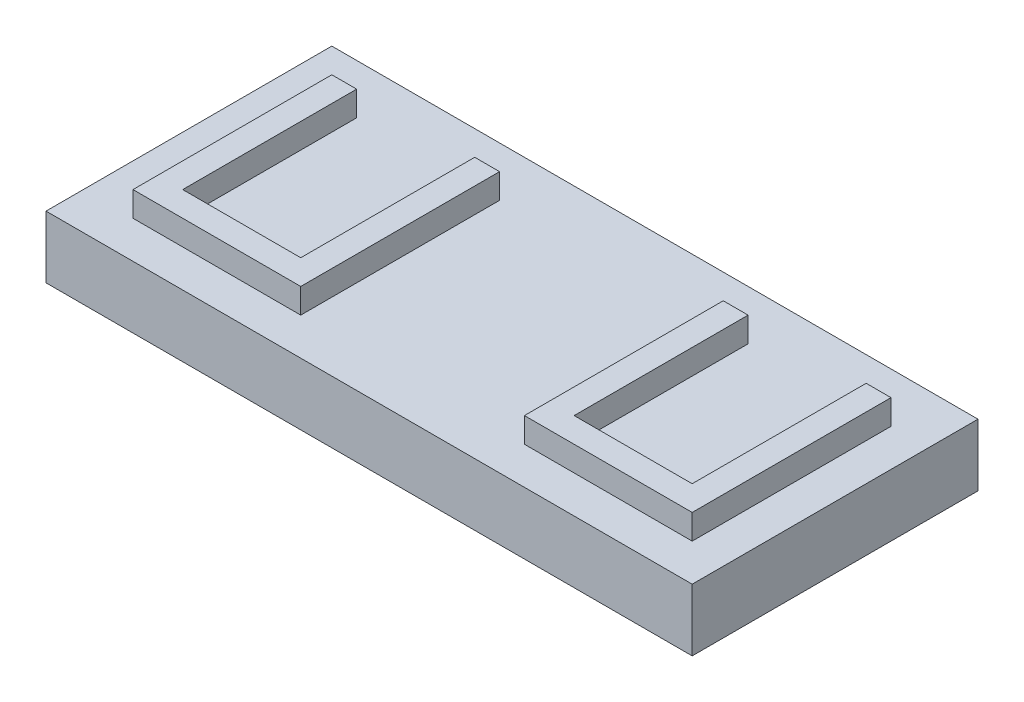
ISO-10303-21;
HEADER;
FILE_DESCRIPTION(('STEP AP214'),'2;1');
FILE_NAME('part.step','',(''),(''),'','','');
FILE_SCHEMA(('AUTOMOTIVE_DESIGN { 1 0 10303 214 1 1 1 1 }'));
ENDSEC;
DATA;
#1=APPLICATION_CONTEXT('core data for automotive mechanical design processes');
#2=APPLICATION_PROTOCOL_DEFINITION('international standard','automotive_design',2000,#1);
#3=PRODUCT_CONTEXT('',#1,'mechanical');
#4=PRODUCT('Part','Part','',(#3));
#5=PRODUCT_RELATED_PRODUCT_CATEGORY('part','',(#4));
#6=PRODUCT_DEFINITION_FORMATION('','',#4);
#7=PRODUCT_DEFINITION_CONTEXT('part definition',#1,'design');
#8=PRODUCT_DEFINITION('design','',#6,#7);
#9=PRODUCT_DEFINITION_SHAPE('','',#8);
#10=(LENGTH_UNIT() NAMED_UNIT(*) SI_UNIT(.MILLI.,.METRE.));
#11=(NAMED_UNIT(*) PLANE_ANGLE_UNIT() SI_UNIT($,.RADIAN.));
#12=(NAMED_UNIT(*) SI_UNIT($,.STERADIAN.) SOLID_ANGLE_UNIT());
#13=UNCERTAINTY_MEASURE_WITH_UNIT(LENGTH_MEASURE(1.E-05),#10,'distance_accuracy_value','');
#14=(GEOMETRIC_REPRESENTATION_CONTEXT(3) GLOBAL_UNCERTAINTY_ASSIGNED_CONTEXT((#13)) GLOBAL_UNIT_ASSIGNED_CONTEXT((#10,
#11,#12)) REPRESENTATION_CONTEXT('',''));
#15=CARTESIAN_POINT('',(0.,0.,0.));
#16=DIRECTION('',(0.,0.,1.));
#17=DIRECTION('',(1.,0.,0.));
#18=AXIS2_PLACEMENT_3D('',#15,#16,#17);
#19=CARTESIAN_POINT('',(0.,5.,0.));
#20=DIRECTION('',(0.,-1.,0.));
#21=DIRECTION('',(0.,0.,-1.));
#22=AXIS2_PLACEMENT_3D('',#19,#20,#21);
#23=PLANE('',#22);
#24=DIRECTION('',(-1.,0.,0.));
#25=VECTOR('',#24,1.);
#26=CARTESIAN_POINT('',(37.5,5.,-19.));
#27=LINE('',#26,#25);
#28=CARTESIAN_POINT('',(37.5,5.,-19.));
#29=VERTEX_POINT('',#28);
#30=CARTESIAN_POINT('',(35.5,5.,-19.));
#31=VERTEX_POINT('',#30);
#32=EDGE_CURVE('E185',#29,#31,#27,.T.);
#33=ORIENTED_EDGE('',*,*,#32,.F.);
#34=DIRECTION('',(0.,0.,-1.));
#35=VECTOR('',#34,1.);
#36=CARTESIAN_POINT('',(37.5,5.,-5.));
#37=LINE('',#36,#35);
#38=CARTESIAN_POINT('',(37.5,5.,-5.));
#39=VERTEX_POINT('',#38);
#40=EDGE_CURVE('E255',#39,#29,#37,.T.);
#41=ORIENTED_EDGE('',*,*,#40,.F.);
#42=DIRECTION('',(-1.,0.,0.));
#43=VECTOR('',#42,1.);
#44=CARTESIAN_POINT('',(47.,5.,-5.));
#45=LINE('',#44,#43);
#46=CARTESIAN_POINT('',(47.,5.,-5.));
#47=VERTEX_POINT('',#46);
#48=EDGE_CURVE('E300',#47,#39,#45,.T.);
#49=ORIENTED_EDGE('',*,*,#48,.F.);
#50=DIRECTION('',(0.,0.,1.));
#51=VECTOR('',#50,1.);
#52=CARTESIAN_POINT('',(47.,5.,-19.));
#53=LINE('',#52,#51);
#54=CARTESIAN_POINT('',(47.,5.,-19.));
#55=VERTEX_POINT('',#54);
#56=EDGE_CURVE('E296',#55,#47,#53,.T.);
#57=ORIENTED_EDGE('',*,*,#56,.F.);
#58=DIRECTION('',(-1.,0.,0.));
#59=VECTOR('',#58,1.);
#60=CARTESIAN_POINT('',(47.,5.,-19.));
#61=LINE('',#60,#59);
#62=CARTESIAN_POINT('',(49.,5.,-19.));
#63=VERTEX_POINT('',#62);
#64=EDGE_CURVE('E292',#63,#55,#61,.T.);
#65=ORIENTED_EDGE('',*,*,#64,.F.);
#66=DIRECTION('',(0.,0.,-1.));
#67=VECTOR('',#66,1.);
#68=CARTESIAN_POINT('',(49.,5.,-19.));
#69=LINE('',#68,#67);
#70=CARTESIAN_POINT('',(49.,5.,-3.));
#71=VERTEX_POINT('',#70);
#72=EDGE_CURVE('E288',#71,#63,#69,.T.);
#73=ORIENTED_EDGE('',*,*,#72,.F.);
#74=DIRECTION('',(1.,0.,0.));
#75=VECTOR('',#74,1.);
#76=CARTESIAN_POINT('',(35.5,5.,-3.));
#77=LINE('',#76,#75);
#78=CARTESIAN_POINT('',(35.5,5.,-3.));
#79=VERTEX_POINT('',#78);
#80=EDGE_CURVE('E284',#79,#71,#77,.T.);
#81=ORIENTED_EDGE('',*,*,#80,.F.);
#82=DIRECTION('',(0.,0.,1.));
#83=VECTOR('',#82,1.);
#84=CARTESIAN_POINT('',(35.5,5.,-19.));
#85=LINE('',#84,#83);
#86=EDGE_CURVE('E280',#31,#79,#85,.T.);
#87=ORIENTED_EDGE('',*,*,#86,.F.);
#88=EDGE_LOOP('',(#33,#41,#49,#57,#65,#73,#81,#87));
#89=FACE_BOUND('',#88,.T.);
#90=DIRECTION('',(0.,0.,1.));
#91=VECTOR('',#90,1.);
#92=CARTESIAN_POINT('',(0.,5.,0.));
#93=LINE('',#92,#91);
#94=CARTESIAN_POINT('',(0.,5.,-23.));
#95=VERTEX_POINT('',#94);
#96=CARTESIAN_POINT('',(0.,5.,0.));
#97=VERTEX_POINT('',#96);
#98=EDGE_CURVE('E339',#95,#97,#93,.T.);
#99=ORIENTED_EDGE('',*,*,#98,.T.);
#100=DIRECTION('',(1.,0.,0.));
#101=VECTOR('',#100,1.);
#102=CARTESIAN_POINT('',(0.,5.,0.));
#103=LINE('',#102,#101);
#104=CARTESIAN_POINT('',(52.,5.,0.));
#105=VERTEX_POINT('',#104);
#106=EDGE_CURVE('E343',#97,#105,#103,.T.);
#107=ORIENTED_EDGE('',*,*,#106,.T.);
#108=DIRECTION('',(0.,0.,-1.));
#109=VECTOR('',#108,1.);
#110=CARTESIAN_POINT('',(52.,5.,0.));
#111=LINE('',#110,#109);
#112=CARTESIAN_POINT('',(52.,5.,-23.));
#113=VERTEX_POINT('',#112);
#114=EDGE_CURVE('E347',#105,#113,#111,.T.);
#115=ORIENTED_EDGE('',*,*,#114,.T.);
#116=DIRECTION('',(-1.,0.,0.));
#117=VECTOR('',#116,1.);
#118=CARTESIAN_POINT('',(0.,5.,-23.));
#119=LINE('',#118,#117);
#120=EDGE_CURVE('E350',#113,#95,#119,.T.);
#121=ORIENTED_EDGE('',*,*,#120,.T.);
#122=EDGE_LOOP('',(#99,#107,#115,#121));
#123=FACE_BOUND('',#122,.T.);
#124=DIRECTION('',(0.,0.,-1.));
#125=VECTOR('',#124,1.);
#126=CARTESIAN_POINT('',(17.5,5.,-19.));
#127=LINE('',#126,#125);
#128=CARTESIAN_POINT('',(17.5,5.,-3.00000000000003));
#129=VERTEX_POINT('',#128);
#130=CARTESIAN_POINT('',(17.5,5.,-19.));
#131=VERTEX_POINT('',#130);
#132=EDGE_CURVE('E177',#129,#131,#127,.T.);
#133=ORIENTED_EDGE('',*,*,#132,.F.);
#134=DIRECTION('',(1.,0.,0.));
#135=VECTOR('',#134,1.);
#136=CARTESIAN_POINT('',(17.5,5.,-3.00000000000003));
#137=LINE('',#136,#135);
#138=CARTESIAN_POINT('',(4.00000000000001,5.,-3.));
#139=VERTEX_POINT('',#138);
#140=EDGE_CURVE('E179',#139,#129,#137,.T.);
#141=ORIENTED_EDGE('',*,*,#140,.F.);
#142=DIRECTION('',(0.,0.,1.));
#143=VECTOR('',#142,1.);
#144=CARTESIAN_POINT('',(4.00000000000001,5.,-19.));
#145=LINE('',#144,#143);
#146=CARTESIAN_POINT('',(4.00000000000001,5.,-19.));
#147=VERTEX_POINT('',#146);
#148=EDGE_CURVE('E197',#147,#139,#145,.T.);
#149=ORIENTED_EDGE('',*,*,#148,.F.);
#150=DIRECTION('',(-1.,0.,0.));
#151=VECTOR('',#150,1.);
#152=CARTESIAN_POINT('',(6.00000000000001,5.,-19.));
#153=LINE('',#152,#151);
#154=CARTESIAN_POINT('',(6.00000000000001,5.,-19.));
#155=VERTEX_POINT('',#154);
#156=EDGE_CURVE('E215',#155,#147,#153,.T.);
#157=ORIENTED_EDGE('',*,*,#156,.F.);
#158=DIRECTION('',(0.,0.,-1.));
#159=VECTOR('',#158,1.);
#160=CARTESIAN_POINT('',(6.00000000000001,5.,-19.));
#161=LINE('',#160,#159);
#162=CARTESIAN_POINT('',(6.00000000000001,5.,-5.));
#163=VERTEX_POINT('',#162);
#164=EDGE_CURVE('E219',#163,#155,#161,.T.);
#165=ORIENTED_EDGE('',*,*,#164,.F.);
#166=DIRECTION('',(-1.,0.,0.));
#167=VECTOR('',#166,1.);
#168=CARTESIAN_POINT('',(6.00000000000001,5.,-5.));
#169=LINE('',#168,#167);
#170=CARTESIAN_POINT('',(15.5,5.,-5.));
#171=VERTEX_POINT('',#170);
#172=EDGE_CURVE('E223',#171,#163,#169,.T.);
#173=ORIENTED_EDGE('',*,*,#172,.F.);
#174=DIRECTION('',(0.,0.,1.));
#175=VECTOR('',#174,1.);
#176=CARTESIAN_POINT('',(15.5,5.,-5.));
#177=LINE('',#176,#175);
#178=CARTESIAN_POINT('',(15.5,5.,-19.));
#179=VERTEX_POINT('',#178);
#180=EDGE_CURVE('E64',#179,#171,#177,.T.);
#181=ORIENTED_EDGE('',*,*,#180,.F.);
#182=DIRECTION('',(-1.,0.,0.));
#183=VECTOR('',#182,1.);
#184=CARTESIAN_POINT('',(15.5,5.,-19.));
#185=LINE('',#184,#183);
#186=EDGE_CURVE('E59',#131,#179,#185,.T.);
#187=ORIENTED_EDGE('',*,*,#186,.F.);
#188=EDGE_LOOP('',(#133,#141,#149,#157,#165,#173,#181,#187));
#189=FACE_BOUND('',#188,.T.);
#190=ADVANCED_FACE('F43',(#89,#123,#189),#23,.F.);
#191=CARTESIAN_POINT('',(0.,5.,0.));
#192=DIRECTION('',(1.,0.,0.));
#193=DIRECTION('',(0.,0.,-1.));
#194=AXIS2_PLACEMENT_3D('',#191,#192,#193);
#195=PLANE('',#194);
#196=DIRECTION('',(0.,0.,1.));
#197=VECTOR('',#196,1.);
#198=CARTESIAN_POINT('',(0.,0.,0.));
#199=LINE('',#198,#197);
#200=CARTESIAN_POINT('',(0.,0.,-23.));
#201=VERTEX_POINT('',#200);
#202=CARTESIAN_POINT('',(0.,0.,0.));
#203=VERTEX_POINT('',#202);
#204=EDGE_CURVE('E338',#201,#203,#199,.T.);
#205=ORIENTED_EDGE('',*,*,#204,.T.);
#206=DIRECTION('',(0.,-1.,0.));
#207=VECTOR('',#206,1.);
#208=CARTESIAN_POINT('',(0.,5.,0.));
#209=LINE('',#208,#207);
#210=EDGE_CURVE('E11',#97,#203,#209,.T.);
#211=ORIENTED_EDGE('',*,*,#210,.F.);
#212=ORIENTED_EDGE('',*,*,#98,.F.);
#213=DIRECTION('',(0.,-1.,0.));
#214=VECTOR('',#213,1.);
#215=CARTESIAN_POINT('',(0.,5.,-23.));
#216=LINE('',#215,#214);
#217=EDGE_CURVE('E353',#95,#201,#216,.T.);
#218=ORIENTED_EDGE('',*,*,#217,.T.);
#219=EDGE_LOOP('',(#205,#211,#212,#218));
#220=FACE_BOUND('',#219,.T.);
#221=ADVANCED_FACE('F45',(#220),#195,.F.);
#222=CARTESIAN_POINT('',(0.,5.,0.));
#223=DIRECTION('',(0.,0.,-1.));
#224=DIRECTION('',(-1.,0.,0.));
#225=AXIS2_PLACEMENT_3D('',#222,#223,#224);
#226=PLANE('',#225);
#227=DIRECTION('',(1.,0.,0.));
#228=VECTOR('',#227,1.);
#229=CARTESIAN_POINT('',(0.,0.,0.));
#230=LINE('',#229,#228);
#231=CARTESIAN_POINT('',(52.,0.,0.));
#232=VERTEX_POINT('',#231);
#233=EDGE_CURVE('E357',#203,#232,#230,.T.);
#234=ORIENTED_EDGE('',*,*,#233,.T.);
#235=DIRECTION('',(0.,-1.,0.));
#236=VECTOR('',#235,1.);
#237=CARTESIAN_POINT('',(52.,5.,0.));
#238=LINE('',#237,#236);
#239=EDGE_CURVE('E52',#105,#232,#238,.T.);
#240=ORIENTED_EDGE('',*,*,#239,.F.);
#241=ORIENTED_EDGE('',*,*,#106,.F.);
#242=ORIENTED_EDGE('',*,*,#210,.T.);
#243=EDGE_LOOP('',(#234,#240,#241,#242));
#244=FACE_BOUND('',#243,.T.);
#245=ADVANCED_FACE('F392',(#244),#226,.F.);
#246=CARTESIAN_POINT('',(52.,5.,0.));
#247=DIRECTION('',(-1.,0.,0.));
#248=DIRECTION('',(0.,0.,1.));
#249=AXIS2_PLACEMENT_3D('',#246,#247,#248);
#250=PLANE('',#249);
#251=DIRECTION('',(0.,0.,-1.));
#252=VECTOR('',#251,1.);
#253=CARTESIAN_POINT('',(52.,0.,0.));
#254=LINE('',#253,#252);
#255=CARTESIAN_POINT('',(52.,0.,-23.));
#256=VERTEX_POINT('',#255);
#257=EDGE_CURVE('E360',#232,#256,#254,.T.);
#258=ORIENTED_EDGE('',*,*,#257,.T.);
#259=DIRECTION('',(0.,-1.,0.));
#260=VECTOR('',#259,1.);
#261=CARTESIAN_POINT('',(52.,5.,-23.));
#262=LINE('',#261,#260);
#263=EDGE_CURVE('E368',#113,#256,#262,.T.);
#264=ORIENTED_EDGE('',*,*,#263,.F.);
#265=ORIENTED_EDGE('',*,*,#114,.F.);
#266=ORIENTED_EDGE('',*,*,#239,.T.);
#267=EDGE_LOOP('',(#258,#264,#265,#266));
#268=FACE_BOUND('',#267,.T.);
#269=ADVANCED_FACE('F377',(#268),#250,.F.);
#270=CARTESIAN_POINT('',(0.,5.,-23.));
#271=DIRECTION('',(0.,0.,1.));
#272=DIRECTION('',(1.,0.,0.));
#273=AXIS2_PLACEMENT_3D('',#270,#271,#272);
#274=PLANE('',#273);
#275=DIRECTION('',(-1.,0.,0.));
#276=VECTOR('',#275,1.);
#277=CARTESIAN_POINT('',(0.,0.,-23.));
#278=LINE('',#277,#276);
#279=EDGE_CURVE('E344',#256,#201,#278,.T.);
#280=ORIENTED_EDGE('',*,*,#279,.T.);
#281=ORIENTED_EDGE('',*,*,#217,.F.);
#282=ORIENTED_EDGE('',*,*,#120,.F.);
#283=ORIENTED_EDGE('',*,*,#263,.T.);
#284=EDGE_LOOP('',(#280,#281,#282,#283));
#285=FACE_BOUND('',#284,.T.);
#286=ADVANCED_FACE('F386',(#285),#274,.F.);
#287=CARTESIAN_POINT('',(0.,0.,0.));
#288=DIRECTION('',(0.,-1.,0.));
#289=DIRECTION('',(0.,0.,-1.));
#290=AXIS2_PLACEMENT_3D('',#287,#288,#289);
#291=PLANE('',#290);
#292=ORIENTED_EDGE('',*,*,#204,.F.);
#293=ORIENTED_EDGE('',*,*,#279,.F.);
#294=ORIENTED_EDGE('',*,*,#257,.F.);
#295=ORIENTED_EDGE('',*,*,#233,.F.);
#296=EDGE_LOOP('',(#292,#293,#294,#295));
#297=FACE_BOUND('',#296,.T.);
#298=ADVANCED_FACE('F383',(#297),#291,.T.);
#299=CARTESIAN_POINT('',(37.5,7.,-19.));
#300=DIRECTION('',(0.,0.,1.));
#301=DIRECTION('',(1.,0.,0.));
#302=AXIS2_PLACEMENT_3D('',#299,#300,#301);
#303=PLANE('',#302);
#304=ORIENTED_EDGE('',*,*,#32,.T.);
#305=DIRECTION('',(0.,-1.,0.));
#306=VECTOR('',#305,1.);
#307=CARTESIAN_POINT('',(35.5,7.,-19.));
#308=LINE('',#307,#306);
#309=CARTESIAN_POINT('',(35.5,7.,-19.));
#310=VERTEX_POINT('',#309);
#311=EDGE_CURVE('E334',#310,#31,#308,.T.);
#312=ORIENTED_EDGE('',*,*,#311,.F.);
#313=DIRECTION('',(-1.,0.,0.));
#314=VECTOR('',#313,1.);
#315=CARTESIAN_POINT('',(37.5,7.,-19.));
#316=LINE('',#315,#314);
#317=CARTESIAN_POINT('',(37.5,7.,-19.));
#318=VERTEX_POINT('',#317);
#319=EDGE_CURVE('E250',#318,#310,#316,.T.);
#320=ORIENTED_EDGE('',*,*,#319,.F.);
#321=DIRECTION('',(0.,-1.,0.));
#322=VECTOR('',#321,1.);
#323=CARTESIAN_POINT('',(37.5,7.,-19.));
#324=LINE('',#323,#322);
#325=EDGE_CURVE('E276',#318,#29,#324,.T.);
#326=ORIENTED_EDGE('',*,*,#325,.T.);
#327=EDGE_LOOP('',(#304,#312,#320,#326));
#328=FACE_BOUND('',#327,.T.);
#329=ADVANCED_FACE('F406',(#328),#303,.F.);
#330=CARTESIAN_POINT('',(35.5,7.,-19.));
#331=DIRECTION('',(1.,0.,0.));
#332=DIRECTION('',(0.,0.,-1.));
#333=AXIS2_PLACEMENT_3D('',#330,#331,#332);
#334=PLANE('',#333);
#335=ORIENTED_EDGE('',*,*,#86,.T.);
#336=DIRECTION('',(0.,-1.,0.));
#337=VECTOR('',#336,1.);
#338=CARTESIAN_POINT('',(35.5,7.,-3.));
#339=LINE('',#338,#337);
#340=CARTESIAN_POINT('',(35.5,7.,-3.));
#341=VERTEX_POINT('',#340);
#342=EDGE_CURVE('E330',#341,#79,#339,.T.);
#343=ORIENTED_EDGE('',*,*,#342,.F.);
#344=DIRECTION('',(0.,0.,1.));
#345=VECTOR('',#344,1.);
#346=CARTESIAN_POINT('',(35.5,7.,-19.));
#347=LINE('',#346,#345);
#348=EDGE_CURVE('E254',#310,#341,#347,.T.);
#349=ORIENTED_EDGE('',*,*,#348,.F.);
#350=ORIENTED_EDGE('',*,*,#311,.T.);
#351=EDGE_LOOP('',(#335,#343,#349,#350));
#352=FACE_BOUND('',#351,.T.);
#353=ADVANCED_FACE('F425',(#352),#334,.F.);
#354=CARTESIAN_POINT('',(35.5,7.,-3.));
#355=DIRECTION('',(0.,0.,-1.));
#356=DIRECTION('',(-1.,0.,0.));
#357=AXIS2_PLACEMENT_3D('',#354,#355,#356);
#358=PLANE('',#357);
#359=ORIENTED_EDGE('',*,*,#80,.T.);
#360=DIRECTION('',(0.,-1.,0.));
#361=VECTOR('',#360,1.);
#362=CARTESIAN_POINT('',(49.,7.,-3.));
#363=LINE('',#362,#361);
#364=CARTESIAN_POINT('',(49.,7.,-3.));
#365=VERTEX_POINT('',#364);
#366=EDGE_CURVE('E326',#365,#71,#363,.T.);
#367=ORIENTED_EDGE('',*,*,#366,.F.);
#368=DIRECTION('',(1.,0.,0.));
#369=VECTOR('',#368,1.);
#370=CARTESIAN_POINT('',(35.5,7.,-3.));
#371=LINE('',#370,#369);
#372=EDGE_CURVE('E258',#341,#365,#371,.T.);
#373=ORIENTED_EDGE('',*,*,#372,.F.);
#374=ORIENTED_EDGE('',*,*,#342,.T.);
#375=EDGE_LOOP('',(#359,#367,#373,#374));
#376=FACE_BOUND('',#375,.T.);
#377=ADVANCED_FACE('F432',(#376),#358,.F.);
#378=CARTESIAN_POINT('',(49.,7.,-19.));
#379=DIRECTION('',(-1.,0.,0.));
#380=DIRECTION('',(0.,0.,1.));
#381=AXIS2_PLACEMENT_3D('',#378,#379,#380);
#382=PLANE('',#381);
#383=ORIENTED_EDGE('',*,*,#72,.T.);
#384=DIRECTION('',(0.,-1.,0.));
#385=VECTOR('',#384,1.);
#386=CARTESIAN_POINT('',(49.,7.,-19.));
#387=LINE('',#386,#385);
#388=CARTESIAN_POINT('',(49.,7.,-19.));
#389=VERTEX_POINT('',#388);
#390=EDGE_CURVE('E322',#389,#63,#387,.T.);
#391=ORIENTED_EDGE('',*,*,#390,.F.);
#392=DIRECTION('',(0.,0.,-1.));
#393=VECTOR('',#392,1.);
#394=CARTESIAN_POINT('',(49.,7.,-19.));
#395=LINE('',#394,#393);
#396=EDGE_CURVE('E261',#365,#389,#395,.T.);
#397=ORIENTED_EDGE('',*,*,#396,.F.);
#398=ORIENTED_EDGE('',*,*,#366,.T.);
#399=EDGE_LOOP('',(#383,#391,#397,#398));
#400=FACE_BOUND('',#399,.T.);
#401=ADVANCED_FACE('F439',(#400),#382,.F.);
#402=CARTESIAN_POINT('',(47.,7.,-19.));
#403=DIRECTION('',(0.,0.,1.));
#404=DIRECTION('',(1.,0.,0.));
#405=AXIS2_PLACEMENT_3D('',#402,#403,#404);
#406=PLANE('',#405);
#407=ORIENTED_EDGE('',*,*,#64,.T.);
#408=DIRECTION('',(0.,-1.,0.));
#409=VECTOR('',#408,1.);
#410=CARTESIAN_POINT('',(47.,7.,-19.));
#411=LINE('',#410,#409);
#412=CARTESIAN_POINT('',(47.,7.,-19.));
#413=VERTEX_POINT('',#412);
#414=EDGE_CURVE('E318',#413,#55,#411,.T.);
#415=ORIENTED_EDGE('',*,*,#414,.F.);
#416=DIRECTION('',(-1.,0.,0.));
#417=VECTOR('',#416,1.);
#418=CARTESIAN_POINT('',(47.,7.,-19.));
#419=LINE('',#418,#417);
#420=EDGE_CURVE('E264',#389,#413,#419,.T.);
#421=ORIENTED_EDGE('',*,*,#420,.F.);
#422=ORIENTED_EDGE('',*,*,#390,.T.);
#423=EDGE_LOOP('',(#407,#415,#421,#422));
#424=FACE_BOUND('',#423,.T.);
#425=ADVANCED_FACE('F447',(#424),#406,.F.);
#426=CARTESIAN_POINT('',(47.,7.,-19.));
#427=DIRECTION('',(1.,0.,0.));
#428=DIRECTION('',(0.,0.,-1.));
#429=AXIS2_PLACEMENT_3D('',#426,#427,#428);
#430=PLANE('',#429);
#431=ORIENTED_EDGE('',*,*,#56,.T.);
#432=DIRECTION('',(0.,-1.,0.));
#433=VECTOR('',#432,1.);
#434=CARTESIAN_POINT('',(47.,7.,-5.));
#435=LINE('',#434,#433);
#436=CARTESIAN_POINT('',(47.,7.,-5.));
#437=VERTEX_POINT('',#436);
#438=EDGE_CURVE('E314',#437,#47,#435,.T.);
#439=ORIENTED_EDGE('',*,*,#438,.F.);
#440=DIRECTION('',(0.,0.,1.));
#441=VECTOR('',#440,1.);
#442=CARTESIAN_POINT('',(47.,7.,-19.));
#443=LINE('',#442,#441);
#444=EDGE_CURVE('E267',#413,#437,#443,.T.);
#445=ORIENTED_EDGE('',*,*,#444,.F.);
#446=ORIENTED_EDGE('',*,*,#414,.T.);
#447=EDGE_LOOP('',(#431,#439,#445,#446));
#448=FACE_BOUND('',#447,.T.);
#449=ADVANCED_FACE('F455',(#448),#430,.F.);
#450=CARTESIAN_POINT('',(47.,7.,-5.));
#451=DIRECTION('',(0.,0.,1.));
#452=DIRECTION('',(1.,0.,0.));
#453=AXIS2_PLACEMENT_3D('',#450,#451,#452);
#454=PLANE('',#453);
#455=ORIENTED_EDGE('',*,*,#48,.T.);
#456=DIRECTION('',(0.,-1.,0.));
#457=VECTOR('',#456,1.);
#458=CARTESIAN_POINT('',(37.5,7.,-5.));
#459=LINE('',#458,#457);
#460=CARTESIAN_POINT('',(37.5,7.,-5.));
#461=VERTEX_POINT('',#460);
#462=EDGE_CURVE('E310',#461,#39,#459,.T.);
#463=ORIENTED_EDGE('',*,*,#462,.F.);
#464=DIRECTION('',(-1.,0.,0.));
#465=VECTOR('',#464,1.);
#466=CARTESIAN_POINT('',(47.,7.,-5.));
#467=LINE('',#466,#465);
#468=EDGE_CURVE('E270',#437,#461,#467,.T.);
#469=ORIENTED_EDGE('',*,*,#468,.F.);
#470=ORIENTED_EDGE('',*,*,#438,.T.);
#471=EDGE_LOOP('',(#455,#463,#469,#470));
#472=FACE_BOUND('',#471,.T.);
#473=ADVANCED_FACE('F463',(#472),#454,.F.);
#474=CARTESIAN_POINT('',(37.5,7.,-5.));
#475=DIRECTION('',(-1.,0.,0.));
#476=DIRECTION('',(0.,0.,1.));
#477=AXIS2_PLACEMENT_3D('',#474,#475,#476);
#478=PLANE('',#477);
#479=ORIENTED_EDGE('',*,*,#40,.T.);
#480=ORIENTED_EDGE('',*,*,#325,.F.);
#481=DIRECTION('',(0.,0.,-1.));
#482=VECTOR('',#481,1.);
#483=CARTESIAN_POINT('',(37.5,7.,-5.));
#484=LINE('',#483,#482);
#485=EDGE_CURVE('E273',#461,#318,#484,.T.);
#486=ORIENTED_EDGE('',*,*,#485,.F.);
#487=ORIENTED_EDGE('',*,*,#462,.T.);
#488=EDGE_LOOP('',(#479,#480,#486,#487));
#489=FACE_BOUND('',#488,.T.);
#490=ADVANCED_FACE('F471',(#489),#478,.F.);
#491=CARTESIAN_POINT('',(0.,7.,0.));
#492=DIRECTION('',(0.,1.,0.));
#493=DIRECTION('',(0.,0.,1.));
#494=AXIS2_PLACEMENT_3D('',#491,#492,#493);
#495=PLANE('',#494);
#496=ORIENTED_EDGE('',*,*,#319,.T.);
#497=ORIENTED_EDGE('',*,*,#348,.T.);
#498=ORIENTED_EDGE('',*,*,#372,.T.);
#499=ORIENTED_EDGE('',*,*,#396,.T.);
#500=ORIENTED_EDGE('',*,*,#420,.T.);
#501=ORIENTED_EDGE('',*,*,#444,.T.);
#502=ORIENTED_EDGE('',*,*,#468,.T.);
#503=ORIENTED_EDGE('',*,*,#485,.T.);
#504=EDGE_LOOP('',(#496,#497,#498,#499,#500,#501,#502,#503));
#505=FACE_BOUND('',#504,.T.);
#506=ADVANCED_FACE('F479',(#505),#495,.T.);
#507=CARTESIAN_POINT('',(17.5,7.,-19.));
#508=DIRECTION('',(-1.,0.,0.));
#509=DIRECTION('',(0.,0.,1.));
#510=AXIS2_PLACEMENT_3D('',#507,#508,#509);
#511=PLANE('',#510);
#512=ORIENTED_EDGE('',*,*,#132,.T.);
#513=DIRECTION('',(0.,-1.,0.));
#514=VECTOR('',#513,1.);
#515=CARTESIAN_POINT('',(17.5,7.,-19.));
#516=LINE('',#515,#514);
#517=CARTESIAN_POINT('',(17.5,7.,-19.));
#518=VERTEX_POINT('',#517);
#519=EDGE_CURVE('E665',#518,#131,#516,.T.);
#520=ORIENTED_EDGE('',*,*,#519,.F.);
#521=DIRECTION('',(0.,0.,-1.));
#522=VECTOR('',#521,1.);
#523=CARTESIAN_POINT('',(17.5,7.,-19.));
#524=LINE('',#523,#522);
#525=CARTESIAN_POINT('',(17.5,7.,-3.00000000000003));
#526=VERTEX_POINT('',#525);
#527=EDGE_CURVE('E198',#526,#518,#524,.T.);
#528=ORIENTED_EDGE('',*,*,#527,.F.);
#529=DIRECTION('',(0.,-1.,0.));
#530=VECTOR('',#529,1.);
#531=CARTESIAN_POINT('',(17.5,7.,-3.00000000000003));
#532=LINE('',#531,#530);
#533=EDGE_CURVE('E192',#526,#129,#532,.T.);
#534=ORIENTED_EDGE('',*,*,#533,.T.);
#535=EDGE_LOOP('',(#512,#520,#528,#534));
#536=FACE_BOUND('',#535,.T.);
#537=ADVANCED_FACE('F200',(#536),#511,.F.);
#538=CARTESIAN_POINT('',(15.5,7.,-19.));
#539=DIRECTION('',(0.,0.,1.));
#540=DIRECTION('',(1.,0.,0.));
#541=AXIS2_PLACEMENT_3D('',#538,#539,#540);
#542=PLANE('',#541);
#543=ORIENTED_EDGE('',*,*,#186,.T.);
#544=DIRECTION('',(0.,-1.,0.));
#545=VECTOR('',#544,1.);
#546=CARTESIAN_POINT('',(15.5,7.,-19.));
#547=LINE('',#546,#545);
#548=CARTESIAN_POINT('',(15.5,7.,-19.));
#549=VERTEX_POINT('',#548);
#550=EDGE_CURVE('E667',#549,#179,#547,.T.);
#551=ORIENTED_EDGE('',*,*,#550,.F.);
#552=DIRECTION('',(-1.,0.,0.));
#553=VECTOR('',#552,1.);
#554=CARTESIAN_POINT('',(15.5,7.,-19.));
#555=LINE('',#554,#553);
#556=EDGE_CURVE('E245',#518,#549,#555,.T.);
#557=ORIENTED_EDGE('',*,*,#556,.F.);
#558=ORIENTED_EDGE('',*,*,#519,.T.);
#559=EDGE_LOOP('',(#543,#551,#557,#558));
#560=FACE_BOUND('',#559,.T.);
#561=ADVANCED_FACE('F494',(#560),#542,.F.);
#562=CARTESIAN_POINT('',(15.5,7.,-5.));
#563=DIRECTION('',(1.,0.,0.));
#564=DIRECTION('',(0.,0.,-1.));
#565=AXIS2_PLACEMENT_3D('',#562,#563,#564);
#566=PLANE('',#565);
#567=ORIENTED_EDGE('',*,*,#180,.T.);
#568=DIRECTION('',(0.,-1.,0.));
#569=VECTOR('',#568,1.);
#570=CARTESIAN_POINT('',(15.5,7.,-5.));
#571=LINE('',#570,#569);
#572=CARTESIAN_POINT('',(15.5,7.,-5.));
#573=VERTEX_POINT('',#572);
#574=EDGE_CURVE('E671',#573,#171,#571,.T.);
#575=ORIENTED_EDGE('',*,*,#574,.F.);
#576=DIRECTION('',(0.,0.,1.));
#577=VECTOR('',#576,1.);
#578=CARTESIAN_POINT('',(15.5,7.,-5.));
#579=LINE('',#578,#577);
#580=EDGE_CURVE('E242',#549,#573,#579,.T.);
#581=ORIENTED_EDGE('',*,*,#580,.F.);
#582=ORIENTED_EDGE('',*,*,#550,.T.);
#583=EDGE_LOOP('',(#567,#575,#581,#582));
#584=FACE_BOUND('',#583,.T.);
#585=ADVANCED_FACE('F501',(#584),#566,.F.);
#586=CARTESIAN_POINT('',(6.00000000000001,7.,-5.));
#587=DIRECTION('',(0.,0.,1.));
#588=DIRECTION('',(1.,0.,0.));
#589=AXIS2_PLACEMENT_3D('',#586,#587,#588);
#590=PLANE('',#589);
#591=ORIENTED_EDGE('',*,*,#172,.T.);
#592=DIRECTION('',(0.,-1.,0.));
#593=VECTOR('',#592,1.);
#594=CARTESIAN_POINT('',(6.00000000000001,7.,-5.));
#595=LINE('',#594,#593);
#596=CARTESIAN_POINT('',(6.00000000000001,7.,-5.));
#597=VERTEX_POINT('',#596);
#598=EDGE_CURVE('E677',#597,#163,#595,.T.);
#599=ORIENTED_EDGE('',*,*,#598,.F.);
#600=DIRECTION('',(-1.,0.,0.));
#601=VECTOR('',#600,1.);
#602=CARTESIAN_POINT('',(6.00000000000001,7.,-5.));
#603=LINE('',#602,#601);
#604=EDGE_CURVE('E239',#573,#597,#603,.T.);
#605=ORIENTED_EDGE('',*,*,#604,.F.);
#606=ORIENTED_EDGE('',*,*,#574,.T.);
#607=EDGE_LOOP('',(#591,#599,#605,#606));
#608=FACE_BOUND('',#607,.T.);
#609=ADVANCED_FACE('F509',(#608),#590,.F.);
#610=CARTESIAN_POINT('',(6.00000000000001,7.,-19.));
#611=DIRECTION('',(-1.,0.,0.));
#612=DIRECTION('',(0.,0.,1.));
#613=AXIS2_PLACEMENT_3D('',#610,#611,#612);
#614=PLANE('',#613);
#615=ORIENTED_EDGE('',*,*,#164,.T.);
#616=DIRECTION('',(0.,-1.,0.));
#617=VECTOR('',#616,1.);
#618=CARTESIAN_POINT('',(6.00000000000001,7.,-19.));
#619=LINE('',#618,#617);
#620=CARTESIAN_POINT('',(6.00000000000001,7.,-19.));
#621=VERTEX_POINT('',#620);
#622=EDGE_CURVE('E681',#621,#155,#619,.T.);
#623=ORIENTED_EDGE('',*,*,#622,.F.);
#624=DIRECTION('',(0.,0.,-1.));
#625=VECTOR('',#624,1.);
#626=CARTESIAN_POINT('',(6.00000000000001,7.,-19.));
#627=LINE('',#626,#625);
#628=EDGE_CURVE('E236',#597,#621,#627,.T.);
#629=ORIENTED_EDGE('',*,*,#628,.F.);
#630=ORIENTED_EDGE('',*,*,#598,.T.);
#631=EDGE_LOOP('',(#615,#623,#629,#630));
#632=FACE_BOUND('',#631,.T.);
#633=ADVANCED_FACE('F517',(#632),#614,.F.);
#634=CARTESIAN_POINT('',(6.00000000000001,7.,-19.));
#635=DIRECTION('',(0.,0.,1.));
#636=DIRECTION('',(1.,0.,0.));
#637=AXIS2_PLACEMENT_3D('',#634,#635,#636);
#638=PLANE('',#637);
#639=ORIENTED_EDGE('',*,*,#156,.T.);
#640=DIRECTION('',(0.,-1.,0.));
#641=VECTOR('',#640,1.);
#642=CARTESIAN_POINT('',(4.00000000000001,7.,-19.));
#643=LINE('',#642,#641);
#644=CARTESIAN_POINT('',(4.00000000000001,7.,-19.));
#645=VERTEX_POINT('',#644);
#646=EDGE_CURVE('E209',#645,#147,#643,.T.);
#647=ORIENTED_EDGE('',*,*,#646,.F.);
#648=DIRECTION('',(-1.,0.,0.));
#649=VECTOR('',#648,1.);
#650=CARTESIAN_POINT('',(6.00000000000001,7.,-19.));
#651=LINE('',#650,#649);
#652=EDGE_CURVE('E233',#621,#645,#651,.T.);
#653=ORIENTED_EDGE('',*,*,#652,.F.);
#654=ORIENTED_EDGE('',*,*,#622,.T.);
#655=EDGE_LOOP('',(#639,#647,#653,#654));
#656=FACE_BOUND('',#655,.T.);
#657=ADVANCED_FACE('F525',(#656),#638,.F.);
#658=CARTESIAN_POINT('',(4.00000000000001,7.,-19.));
#659=DIRECTION('',(1.,0.,0.));
#660=DIRECTION('',(0.,0.,-1.));
#661=AXIS2_PLACEMENT_3D('',#658,#659,#660);
#662=PLANE('',#661);
#663=ORIENTED_EDGE('',*,*,#148,.T.);
#664=DIRECTION('',(0.,-1.,0.));
#665=VECTOR('',#664,1.);
#666=CARTESIAN_POINT('',(4.00000000000001,7.,-3.));
#667=LINE('',#666,#665);
#668=CARTESIAN_POINT('',(4.00000000000001,7.,-3.));
#669=VERTEX_POINT('',#668);
#670=EDGE_CURVE('E195',#669,#139,#667,.T.);
#671=ORIENTED_EDGE('',*,*,#670,.F.);
#672=DIRECTION('',(0.,0.,1.));
#673=VECTOR('',#672,1.);
#674=CARTESIAN_POINT('',(4.00000000000001,7.,-19.));
#675=LINE('',#674,#673);
#676=EDGE_CURVE('E207',#645,#669,#675,.T.);
#677=ORIENTED_EDGE('',*,*,#676,.F.);
#678=ORIENTED_EDGE('',*,*,#646,.T.);
#679=EDGE_LOOP('',(#663,#671,#677,#678));
#680=FACE_BOUND('',#679,.T.);
#681=ADVANCED_FACE('F533',(#680),#662,.F.);
#682=CARTESIAN_POINT('',(17.5,7.,-3.00000000000003));
#683=DIRECTION('',(0.,0.,-1.));
#684=DIRECTION('',(-1.,0.,0.));
#685=AXIS2_PLACEMENT_3D('',#682,#683,#684);
#686=PLANE('',#685);
#687=ORIENTED_EDGE('',*,*,#140,.T.);
#688=ORIENTED_EDGE('',*,*,#533,.F.);
#689=DIRECTION('',(1.,0.,0.));
#690=VECTOR('',#689,1.);
#691=CARTESIAN_POINT('',(17.5,7.,-3.00000000000003));
#692=LINE('',#691,#690);
#693=EDGE_CURVE('E203',#669,#526,#692,.T.);
#694=ORIENTED_EDGE('',*,*,#693,.F.);
#695=ORIENTED_EDGE('',*,*,#670,.T.);
#696=EDGE_LOOP('',(#687,#688,#694,#695));
#697=FACE_BOUND('',#696,.T.);
#698=ADVANCED_FACE('F190',(#697),#686,.F.);
#699=CARTESIAN_POINT('',(0.,7.,0.));
#700=DIRECTION('',(0.,-1.,0.));
#701=DIRECTION('',(0.,0.,-1.));
#702=AXIS2_PLACEMENT_3D('',#699,#700,#701);
#703=PLANE('',#702);
#704=ORIENTED_EDGE('',*,*,#527,.T.);
#705=ORIENTED_EDGE('',*,*,#556,.T.);
#706=ORIENTED_EDGE('',*,*,#580,.T.);
#707=ORIENTED_EDGE('',*,*,#604,.T.);
#708=ORIENTED_EDGE('',*,*,#628,.T.);
#709=ORIENTED_EDGE('',*,*,#652,.T.);
#710=ORIENTED_EDGE('',*,*,#676,.T.);
#711=ORIENTED_EDGE('',*,*,#693,.T.);
#712=EDGE_LOOP('',(#704,#705,#706,#707,#708,#709,#710,#711));
#713=FACE_BOUND('',#712,.T.);
#714=ADVANCED_FACE('F548',(#713),#703,.F.);
#715=CLOSED_SHELL('',(#190,#221,#245,#269,#286,#298,#329,#353,#377,#401,#425,#449,#473,#490,
#506,#537,#561,#585,#609,#633,#657,#681,#698,#714));
#716=MANIFOLD_SOLID_BREP('B2',#715);
#717=ADVANCED_BREP_SHAPE_REPRESENTATION('',(#18,#716),#14);
#718=SHAPE_DEFINITION_REPRESENTATION(#9,#717);
ENDSEC;
END-ISO-10303-21;
